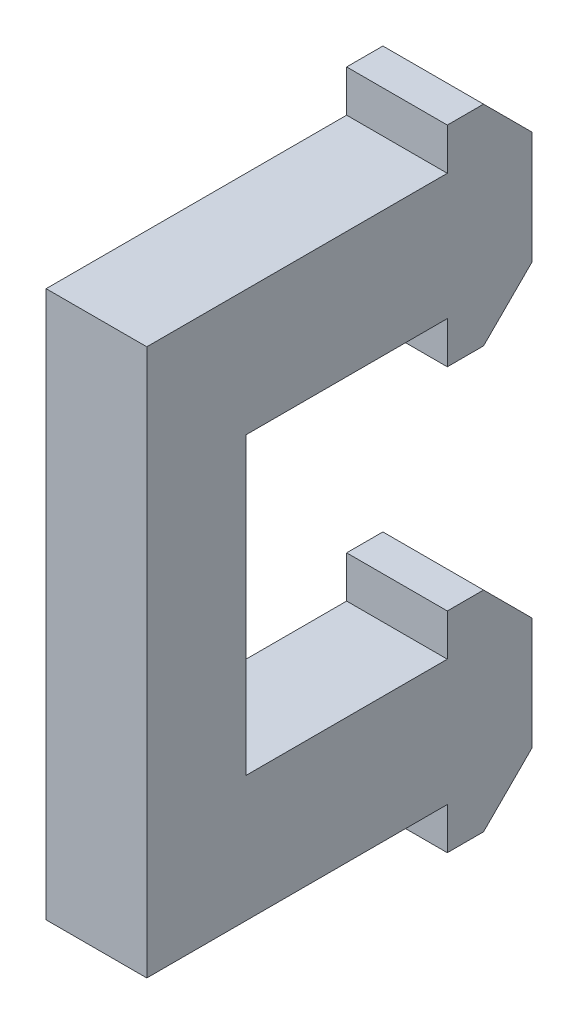
ISO-10303-21;
HEADER;
FILE_DESCRIPTION(('STEP AP214'),'2;1');
FILE_NAME('part.step','',(''),(''),'','','');
FILE_SCHEMA(('AUTOMOTIVE_DESIGN { 1 0 10303 214 1 1 1 1 }'));
ENDSEC;
DATA;
#1=APPLICATION_CONTEXT('core data for automotive mechanical design processes');
#2=APPLICATION_PROTOCOL_DEFINITION('international standard','automotive_design',2000,#1);
#3=PRODUCT_CONTEXT('',#1,'mechanical');
#4=PRODUCT('Part','Part','',(#3));
#5=PRODUCT_RELATED_PRODUCT_CATEGORY('part','',(#4));
#6=PRODUCT_DEFINITION_FORMATION('','',#4);
#7=PRODUCT_DEFINITION_CONTEXT('part definition',#1,'design');
#8=PRODUCT_DEFINITION('design','',#6,#7);
#9=PRODUCT_DEFINITION_SHAPE('','',#8);
#10=(LENGTH_UNIT() NAMED_UNIT(*) SI_UNIT(.MILLI.,.METRE.));
#11=(NAMED_UNIT(*) PLANE_ANGLE_UNIT() SI_UNIT($,.RADIAN.));
#12=(NAMED_UNIT(*) SI_UNIT($,.STERADIAN.) SOLID_ANGLE_UNIT());
#13=UNCERTAINTY_MEASURE_WITH_UNIT(LENGTH_MEASURE(1.E-05),#10,'distance_accuracy_value','');
#14=(GEOMETRIC_REPRESENTATION_CONTEXT(3) GLOBAL_UNCERTAINTY_ASSIGNED_CONTEXT((#13)) GLOBAL_UNIT_ASSIGNED_CONTEXT((#10,
#11,#12)) REPRESENTATION_CONTEXT('',''));
#15=CARTESIAN_POINT('',(0.,0.,0.));
#16=DIRECTION('',(0.,0.,1.));
#17=DIRECTION('',(1.,0.,0.));
#18=AXIS2_PLACEMENT_3D('',#15,#16,#17);
#19=CARTESIAN_POINT('',(5.,3.125,4.2));
#20=DIRECTION('',(0.,0.,-1.));
#21=DIRECTION('',(-1.,0.,0.));
#22=AXIS2_PLACEMENT_3D('',#19,#20,#21);
#23=PLANE('',#22);
#24=DIRECTION('',(0.,-1.,0.));
#25=VECTOR('',#24,1.);
#26=CARTESIAN_POINT('',(0.,3.125,4.2));
#27=LINE('',#26,#25);
#28=CARTESIAN_POINT('',(0.,5.2,4.2));
#29=VERTEX_POINT('',#28);
#30=CARTESIAN_POINT('',(0.,3.125,4.2));
#31=VERTEX_POINT('',#30);
#32=EDGE_CURVE('E148',#29,#31,#27,.T.);
#33=ORIENTED_EDGE('',*,*,#32,.T.);
#34=DIRECTION('',(-1.,0.,0.));
#35=VECTOR('',#34,1.);
#36=CARTESIAN_POINT('',(5.,3.125,4.2));
#37=LINE('',#36,#35);
#38=CARTESIAN_POINT('',(5.,3.125,4.2));
#39=VERTEX_POINT('',#38);
#40=EDGE_CURVE('E11',#39,#31,#37,.T.);
#41=ORIENTED_EDGE('',*,*,#40,.F.);
#42=DIRECTION('',(0.,-1.,0.));
#43=VECTOR('',#42,1.);
#44=CARTESIAN_POINT('',(5.,3.125,4.2));
#45=LINE('',#44,#43);
#46=CARTESIAN_POINT('',(5.,5.2,4.2));
#47=VERTEX_POINT('',#46);
#48=EDGE_CURVE('E167',#47,#39,#45,.T.);
#49=ORIENTED_EDGE('',*,*,#48,.F.);
#50=DIRECTION('',(-1.,0.,0.));
#51=VECTOR('',#50,1.);
#52=CARTESIAN_POINT('',(5.,5.2,4.2));
#53=LINE('',#52,#51);
#54=EDGE_CURVE('E144',#47,#29,#53,.T.);
#55=ORIENTED_EDGE('',*,*,#54,.T.);
#56=EDGE_LOOP('',(#33,#41,#49,#55));
#57=FACE_BOUND('',#56,.T.);
#58=ADVANCED_FACE('F37',(#57),#23,.F.);
#59=CARTESIAN_POINT('',(5.,3.125,4.2));
#60=DIRECTION('',(0.,-1.,0.));
#61=DIRECTION('',(0.,0.,-1.));
#62=AXIS2_PLACEMENT_3D('',#59,#60,#61);
#63=PLANE('',#62);
#64=DIRECTION('',(0.,0.,1.));
#65=VECTOR('',#64,1.);
#66=CARTESIAN_POINT('',(0.,3.125,4.2));
#67=LINE('',#66,#65);
#68=CARTESIAN_POINT('',(0.,3.125,14.2));
#69=VERTEX_POINT('',#68);
#70=EDGE_CURVE('E151',#31,#69,#67,.T.);
#71=ORIENTED_EDGE('',*,*,#70,.T.);
#72=DIRECTION('',(-1.,0.,0.));
#73=VECTOR('',#72,1.);
#74=CARTESIAN_POINT('',(5.,3.125,14.2));
#75=LINE('',#74,#73);
#76=CARTESIAN_POINT('',(5.,3.125,14.2));
#77=VERTEX_POINT('',#76);
#78=EDGE_CURVE('E44',#77,#69,#75,.T.);
#79=ORIENTED_EDGE('',*,*,#78,.F.);
#80=DIRECTION('',(0.,0.,1.));
#81=VECTOR('',#80,1.);
#82=CARTESIAN_POINT('',(5.,3.125,4.2));
#83=LINE('',#82,#81);
#84=EDGE_CURVE('E101',#39,#77,#83,.T.);
#85=ORIENTED_EDGE('',*,*,#84,.F.);
#86=ORIENTED_EDGE('',*,*,#40,.T.);
#87=EDGE_LOOP('',(#71,#79,#85,#86));
#88=FACE_BOUND('',#87,.T.);
#89=ADVANCED_FACE('F188',(#88),#63,.F.);
#90=CARTESIAN_POINT('',(5.,-3.125,14.2));
#91=DIRECTION('',(0.,1.,0.));
#92=DIRECTION('',(0.,0.,1.));
#93=AXIS2_PLACEMENT_3D('',#90,#91,#92);
#94=PLANE('',#93);
#95=DIRECTION('',(0.,0.,-1.));
#96=VECTOR('',#95,1.);
#97=CARTESIAN_POINT('',(0.,-3.125,14.2));
#98=LINE('',#97,#96);
#99=CARTESIAN_POINT('',(0.,-3.125,19.1256451982316));
#100=VERTEX_POINT('',#99);
#101=CARTESIAN_POINT('',(0.,-3.125,4.2));
#102=VERTEX_POINT('',#101);
#103=EDGE_CURVE('E155',#100,#102,#98,.T.);
#104=ORIENTED_EDGE('',*,*,#103,.T.);
#105=DIRECTION('',(-1.,0.,0.));
#106=VECTOR('',#105,1.);
#107=CARTESIAN_POINT('',(5.,-3.125,4.2));
#108=LINE('',#107,#106);
#109=CARTESIAN_POINT('',(5.,-3.125,4.2));
#110=VERTEX_POINT('',#109);
#111=EDGE_CURVE('E177',#110,#102,#108,.T.);
#112=ORIENTED_EDGE('',*,*,#111,.F.);
#113=DIRECTION('',(0.,0.,-1.));
#114=VECTOR('',#113,1.);
#115=CARTESIAN_POINT('',(5.,-3.125,14.2));
#116=LINE('',#115,#114);
#117=CARTESIAN_POINT('',(5.,-3.125,19.1256451982316));
#118=VERTEX_POINT('',#117);
#119=EDGE_CURVE('E209',#118,#110,#116,.T.);
#120=ORIENTED_EDGE('',*,*,#119,.F.);
#121=DIRECTION('',(-1.,0.,0.));
#122=VECTOR('',#121,1.);
#123=CARTESIAN_POINT('',(39.1568924685001,-3.125,19.1256451982316));
#124=LINE('',#123,#122);
#125=EDGE_CURVE('E196',#118,#100,#124,.T.);
#126=ORIENTED_EDGE('',*,*,#125,.T.);
#127=EDGE_LOOP('',(#104,#112,#120,#126));
#128=FACE_BOUND('',#127,.T.);
#129=ADVANCED_FACE('F329',(#128),#94,.F.);
#130=CARTESIAN_POINT('',(5.,-3.125,4.2));
#131=DIRECTION('',(0.,0.,-1.));
#132=DIRECTION('',(-1.,0.,0.));
#133=AXIS2_PLACEMENT_3D('',#130,#131,#132);
#134=PLANE('',#133);
#135=DIRECTION('',(0.,-1.,0.));
#136=VECTOR('',#135,1.);
#137=CARTESIAN_POINT('',(0.,-3.125,4.2));
#138=LINE('',#137,#136);
#139=CARTESIAN_POINT('',(0.,-5.2,4.2));
#140=VERTEX_POINT('',#139);
#141=EDGE_CURVE('E157',#102,#140,#138,.T.);
#142=ORIENTED_EDGE('',*,*,#141,.T.);
#143=DIRECTION('',(-1.,0.,0.));
#144=VECTOR('',#143,1.);
#145=CARTESIAN_POINT('',(5.,-5.2,4.2));
#146=LINE('',#145,#144);
#147=CARTESIAN_POINT('',(5.,-5.2,4.2));
#148=VERTEX_POINT('',#147);
#149=EDGE_CURVE('E174',#148,#140,#146,.T.);
#150=ORIENTED_EDGE('',*,*,#149,.F.);
#151=DIRECTION('',(0.,-1.,0.));
#152=VECTOR('',#151,1.);
#153=CARTESIAN_POINT('',(5.,-3.125,4.2));
#154=LINE('',#153,#152);
#155=EDGE_CURVE('E211',#110,#148,#154,.T.);
#156=ORIENTED_EDGE('',*,*,#155,.F.);
#157=ORIENTED_EDGE('',*,*,#111,.T.);
#158=EDGE_LOOP('',(#142,#150,#156,#157));
#159=FACE_BOUND('',#158,.T.);
#160=ADVANCED_FACE('F411',(#159),#134,.F.);
#161=CARTESIAN_POINT('',(5.,-5.2,4.2));
#162=DIRECTION('',(0.,1.,0.));
#163=DIRECTION('',(0.,0.,1.));
#164=AXIS2_PLACEMENT_3D('',#161,#162,#163);
#165=PLANE('',#164);
#166=DIRECTION('',(0.,0.,-1.));
#167=VECTOR('',#166,1.);
#168=CARTESIAN_POINT('',(0.,-5.2,4.2));
#169=LINE('',#168,#167);
#170=CARTESIAN_POINT('',(0.,-5.2,2.4));
#171=VERTEX_POINT('',#170);
#172=EDGE_CURVE('E159',#140,#171,#169,.T.);
#173=ORIENTED_EDGE('',*,*,#172,.T.);
#174=DIRECTION('',(-1.,0.,0.));
#175=VECTOR('',#174,1.);
#176=CARTESIAN_POINT('',(5.,-5.2,2.4));
#177=LINE('',#176,#175);
#178=CARTESIAN_POINT('',(5.,-5.2,2.4));
#179=VERTEX_POINT('',#178);
#180=EDGE_CURVE('E171',#179,#171,#177,.T.);
#181=ORIENTED_EDGE('',*,*,#180,.F.);
#182=DIRECTION('',(0.,0.,-1.));
#183=VECTOR('',#182,1.);
#184=CARTESIAN_POINT('',(5.,-5.2,4.2));
#185=LINE('',#184,#183);
#186=EDGE_CURVE('E213',#148,#179,#185,.T.);
#187=ORIENTED_EDGE('',*,*,#186,.F.);
#188=ORIENTED_EDGE('',*,*,#149,.T.);
#189=EDGE_LOOP('',(#173,#181,#187,#188));
#190=FACE_BOUND('',#189,.T.);
#191=ADVANCED_FACE('F219',(#190),#165,.F.);
#192=CARTESIAN_POINT('',(5.,-5.2,2.4));
#193=DIRECTION('',(0.,0.707106781186548,0.707106781186548));
#194=DIRECTION('',(0.,-0.707106781186548,0.707106781186548));
#195=AXIS2_PLACEMENT_3D('',#192,#193,#194);
#196=PLANE('',#195);
#197=DIRECTION('',(0.,0.707106781186547,-0.707106781186547));
#198=VECTOR('',#197,1.);
#199=CARTESIAN_POINT('',(0.,-5.2,2.4));
#200=LINE('',#199,#198);
#201=CARTESIAN_POINT('',(0.,-2.8,0.));
#202=VERTEX_POINT('',#201);
#203=EDGE_CURVE('E161',#171,#202,#200,.T.);
#204=ORIENTED_EDGE('',*,*,#203,.T.);
#205=DIRECTION('',(-1.,0.,0.));
#206=VECTOR('',#205,1.);
#207=CARTESIAN_POINT('',(5.,-2.8,0.));
#208=LINE('',#207,#206);
#209=CARTESIAN_POINT('',(5.,-2.8,0.));
#210=VERTEX_POINT('',#209);
#211=EDGE_CURVE('E139',#210,#202,#208,.T.);
#212=ORIENTED_EDGE('',*,*,#211,.F.);
#213=DIRECTION('',(0.,0.707106781186547,-0.707106781186547));
#214=VECTOR('',#213,1.);
#215=CARTESIAN_POINT('',(5.,-5.2,2.4));
#216=LINE('',#215,#214);
#217=EDGE_CURVE('E127',#179,#210,#216,.T.);
#218=ORIENTED_EDGE('',*,*,#217,.F.);
#219=ORIENTED_EDGE('',*,*,#180,.T.);
#220=EDGE_LOOP('',(#204,#212,#218,#219));
#221=FACE_BOUND('',#220,.T.);
#222=ADVANCED_FACE('F223',(#221),#196,.F.);
#223=CARTESIAN_POINT('',(5.,2.8,0.));
#224=DIRECTION('',(0.,0.,1.));
#225=DIRECTION('',(0.,-1.,0.));
#226=AXIS2_PLACEMENT_3D('',#223,#224,#225);
#227=PLANE('',#226);
#228=DIRECTION('',(0.,1.,0.));
#229=VECTOR('',#228,1.);
#230=CARTESIAN_POINT('',(0.,2.8,0.));
#231=LINE('',#230,#229);
#232=CARTESIAN_POINT('',(0.,2.8,0.));
#233=VERTEX_POINT('',#232);
#234=EDGE_CURVE('E136',#202,#233,#231,.T.);
#235=ORIENTED_EDGE('',*,*,#234,.T.);
#236=DIRECTION('',(-1.,0.,0.));
#237=VECTOR('',#236,1.);
#238=CARTESIAN_POINT('',(5.,2.8,0.));
#239=LINE('',#238,#237);
#240=CARTESIAN_POINT('',(5.,2.8,0.));
#241=VERTEX_POINT('',#240);
#242=EDGE_CURVE('E133',#241,#233,#239,.T.);
#243=ORIENTED_EDGE('',*,*,#242,.F.);
#244=DIRECTION('',(0.,1.,0.));
#245=VECTOR('',#244,1.);
#246=CARTESIAN_POINT('',(5.,2.8,0.));
#247=LINE('',#246,#245);
#248=EDGE_CURVE('E119',#210,#241,#247,.T.);
#249=ORIENTED_EDGE('',*,*,#248,.F.);
#250=ORIENTED_EDGE('',*,*,#211,.T.);
#251=EDGE_LOOP('',(#235,#243,#249,#250));
#252=FACE_BOUND('',#251,.T.);
#253=ADVANCED_FACE('F134',(#252),#227,.F.);
#254=CARTESIAN_POINT('',(5.,5.2,2.4));
#255=DIRECTION('',(0.,-0.707106781186548,0.707106781186547));
#256=DIRECTION('',(0.,-0.707106781186547,-0.707106781186548));
#257=AXIS2_PLACEMENT_3D('',#254,#255,#256);
#258=PLANE('',#257);
#259=DIRECTION('',(0.,0.707106781186547,0.707106781186548));
#260=VECTOR('',#259,1.);
#261=CARTESIAN_POINT('',(0.,5.2,2.4));
#262=LINE('',#261,#260);
#263=CARTESIAN_POINT('',(0.,5.2,2.4));
#264=VERTEX_POINT('',#263);
#265=EDGE_CURVE('E164',#233,#264,#262,.T.);
#266=ORIENTED_EDGE('',*,*,#265,.T.);
#267=DIRECTION('',(-1.,0.,0.));
#268=VECTOR('',#267,1.);
#269=CARTESIAN_POINT('',(5.,5.2,2.4));
#270=LINE('',#269,#268);
#271=CARTESIAN_POINT('',(5.,5.2,2.4));
#272=VERTEX_POINT('',#271);
#273=EDGE_CURVE('E140',#272,#264,#270,.T.);
#274=ORIENTED_EDGE('',*,*,#273,.F.);
#275=DIRECTION('',(0.,0.707106781186547,0.707106781186548));
#276=VECTOR('',#275,1.);
#277=CARTESIAN_POINT('',(5.,5.2,2.4));
#278=LINE('',#277,#276);
#279=EDGE_CURVE('E124',#241,#272,#278,.T.);
#280=ORIENTED_EDGE('',*,*,#279,.F.);
#281=ORIENTED_EDGE('',*,*,#242,.T.);
#282=EDGE_LOOP('',(#266,#274,#280,#281));
#283=FACE_BOUND('',#282,.T.);
#284=ADVANCED_FACE('F142',(#283),#258,.F.);
#285=CARTESIAN_POINT('',(5.,5.2,4.2));
#286=DIRECTION('',(0.,-1.,0.));
#287=DIRECTION('',(0.,0.,-1.));
#288=AXIS2_PLACEMENT_3D('',#285,#286,#287);
#289=PLANE('',#288);
#290=DIRECTION('',(0.,0.,1.));
#291=VECTOR('',#290,1.);
#292=CARTESIAN_POINT('',(0.,5.2,4.2));
#293=LINE('',#292,#291);
#294=EDGE_CURVE('E93',#264,#29,#293,.T.);
#295=ORIENTED_EDGE('',*,*,#294,.T.);
#296=ORIENTED_EDGE('',*,*,#54,.F.);
#297=DIRECTION('',(0.,0.,1.));
#298=VECTOR('',#297,1.);
#299=CARTESIAN_POINT('',(5.,5.2,4.2));
#300=LINE('',#299,#298);
#301=EDGE_CURVE('E60',#272,#47,#300,.T.);
#302=ORIENTED_EDGE('',*,*,#301,.F.);
#303=ORIENTED_EDGE('',*,*,#273,.T.);
#304=EDGE_LOOP('',(#295,#296,#302,#303));
#305=FACE_BOUND('',#304,.T.);
#306=ADVANCED_FACE('F224',(#305),#289,.F.);
#307=CARTESIAN_POINT('',(5.,0.,0.));
#308=DIRECTION('',(-1.,0.,0.));
#309=DIRECTION('',(0.,0.,1.));
#310=AXIS2_PLACEMENT_3D('',#307,#308,#309);
#311=PLANE('',#310);
#312=DIRECTION('',(0.,0.,-1.));
#313=VECTOR('',#312,1.);
#314=CARTESIAN_POINT('',(5.,24.025,14.2));
#315=LINE('',#314,#313);
#316=CARTESIAN_POINT('',(5.,24.025,19.1256451982316));
#317=VERTEX_POINT('',#316);
#318=CARTESIAN_POINT('',(5.,24.025,4.19999999999999));
#319=VERTEX_POINT('',#318);
#320=EDGE_CURVE('E288',#317,#319,#315,.T.);
#321=ORIENTED_EDGE('',*,*,#320,.F.);
#322=DIRECTION('',(0.,-1.,0.));
#323=VECTOR('',#322,1.);
#324=CARTESIAN_POINT('',(5.,-3.125,19.1256451982316));
#325=LINE('',#324,#323);
#326=EDGE_CURVE('E206',#317,#118,#325,.T.);
#327=ORIENTED_EDGE('',*,*,#326,.T.);
#328=ORIENTED_EDGE('',*,*,#119,.T.);
#329=ORIENTED_EDGE('',*,*,#155,.T.);
#330=ORIENTED_EDGE('',*,*,#186,.T.);
#331=ORIENTED_EDGE('',*,*,#217,.T.);
#332=ORIENTED_EDGE('',*,*,#248,.T.);
#333=ORIENTED_EDGE('',*,*,#279,.T.);
#334=ORIENTED_EDGE('',*,*,#301,.T.);
#335=ORIENTED_EDGE('',*,*,#48,.T.);
#336=ORIENTED_EDGE('',*,*,#84,.T.);
#337=DIRECTION('',(0.,1.,0.));
#338=VECTOR('',#337,1.);
#339=CARTESIAN_POINT('',(5.,-3.125,14.2));
#340=LINE('',#339,#338);
#341=CARTESIAN_POINT('',(5.,17.775,14.2));
#342=VERTEX_POINT('',#341);
#343=EDGE_CURVE('E152',#77,#342,#340,.T.);
#344=ORIENTED_EDGE('',*,*,#343,.T.);
#345=DIRECTION('',(0.,0.,1.));
#346=VECTOR('',#345,1.);
#347=CARTESIAN_POINT('',(5.,17.775,4.19999999999999));
#348=LINE('',#347,#346);
#349=CARTESIAN_POINT('',(5.,17.775,4.19999999999999));
#350=VERTEX_POINT('',#349);
#351=EDGE_CURVE('E232',#350,#342,#348,.T.);
#352=ORIENTED_EDGE('',*,*,#351,.F.);
#353=DIRECTION('',(0.,1.,0.));
#354=VECTOR('',#353,1.);
#355=CARTESIAN_POINT('',(5.,17.775,4.19999999999999));
#356=LINE('',#355,#354);
#357=CARTESIAN_POINT('',(5.,15.7,4.2));
#358=VERTEX_POINT('',#357);
#359=EDGE_CURVE('E262',#358,#350,#356,.T.);
#360=ORIENTED_EDGE('',*,*,#359,.F.);
#361=DIRECTION('',(0.,0.,1.));
#362=VECTOR('',#361,1.);
#363=CARTESIAN_POINT('',(5.,15.7,4.2));
#364=LINE('',#363,#362);
#365=CARTESIAN_POINT('',(5.,15.7,2.4));
#366=VERTEX_POINT('',#365);
#367=EDGE_CURVE('E306',#366,#358,#364,.T.);
#368=ORIENTED_EDGE('',*,*,#367,.F.);
#369=DIRECTION('',(0.,-0.707106781186547,0.707106781186548));
#370=VECTOR('',#369,1.);
#371=CARTESIAN_POINT('',(5.,15.7,2.4));
#372=LINE('',#371,#370);
#373=CARTESIAN_POINT('',(5.,18.1,0.));
#374=VERTEX_POINT('',#373);
#375=EDGE_CURVE('E303',#374,#366,#372,.T.);
#376=ORIENTED_EDGE('',*,*,#375,.F.);
#377=DIRECTION('',(0.,-1.,0.));
#378=VECTOR('',#377,1.);
#379=CARTESIAN_POINT('',(5.,18.1,0.));
#380=LINE('',#379,#378);
#381=CARTESIAN_POINT('',(5.,23.7,0.));
#382=VERTEX_POINT('',#381);
#383=EDGE_CURVE('E300',#382,#374,#380,.T.);
#384=ORIENTED_EDGE('',*,*,#383,.F.);
#385=DIRECTION('',(0.,-0.707106781186548,-0.707106781186547));
#386=VECTOR('',#385,1.);
#387=CARTESIAN_POINT('',(5.,26.1,2.39999999999998));
#388=LINE('',#387,#386);
#389=CARTESIAN_POINT('',(5.,26.1,2.39999999999998));
#390=VERTEX_POINT('',#389);
#391=EDGE_CURVE('E297',#390,#382,#388,.T.);
#392=ORIENTED_EDGE('',*,*,#391,.F.);
#393=DIRECTION('',(0.,0.,-1.));
#394=VECTOR('',#393,1.);
#395=CARTESIAN_POINT('',(5.,26.1,4.19999999999998));
#396=LINE('',#395,#394);
#397=CARTESIAN_POINT('',(5.,26.1,4.19999999999998));
#398=VERTEX_POINT('',#397);
#399=EDGE_CURVE('E294',#398,#390,#396,.T.);
#400=ORIENTED_EDGE('',*,*,#399,.F.);
#401=DIRECTION('',(0.,1.,0.));
#402=VECTOR('',#401,1.);
#403=CARTESIAN_POINT('',(5.,24.025,4.19999999999999));
#404=LINE('',#403,#402);
#405=EDGE_CURVE('E291',#319,#398,#404,.T.);
#406=ORIENTED_EDGE('',*,*,#405,.F.);
#407=EDGE_LOOP('',(#321,#327,#328,#329,#330,#331,#332,#333,#334,#335,#336,#344,#352,#360,#368,
#376,#384,#392,#400,#406));
#408=FACE_BOUND('',#407,.T.);
#409=ADVANCED_FACE('F122',(#408),#311,.F.);
#410=CARTESIAN_POINT('',(0.,0.,0.));
#411=DIRECTION('',(-1.,0.,0.));
#412=DIRECTION('',(0.,0.,1.));
#413=AXIS2_PLACEMENT_3D('',#410,#411,#412);
#414=PLANE('',#413);
#415=DIRECTION('',(0.,1.,0.));
#416=VECTOR('',#415,1.);
#417=CARTESIAN_POINT('',(0.,-3.125,19.1256451982316));
#418=LINE('',#417,#416);
#419=CARTESIAN_POINT('',(0.,24.025,19.1256451982316));
#420=VERTEX_POINT('',#419);
#421=EDGE_CURVE('E193',#100,#420,#418,.T.);
#422=ORIENTED_EDGE('',*,*,#421,.T.);
#423=DIRECTION('',(0.,0.,-1.));
#424=VECTOR('',#423,1.);
#425=CARTESIAN_POINT('',(0.,24.025,14.2));
#426=LINE('',#425,#424);
#427=CARTESIAN_POINT('',(0.,24.025,4.19999999999999));
#428=VERTEX_POINT('',#427);
#429=EDGE_CURVE('E263',#420,#428,#426,.T.);
#430=ORIENTED_EDGE('',*,*,#429,.T.);
#431=DIRECTION('',(0.,1.,0.));
#432=VECTOR('',#431,1.);
#433=CARTESIAN_POINT('',(0.,24.025,4.19999999999999));
#434=LINE('',#433,#432);
#435=CARTESIAN_POINT('',(0.,26.1,4.19999999999998));
#436=VERTEX_POINT('',#435);
#437=EDGE_CURVE('E266',#428,#436,#434,.T.);
#438=ORIENTED_EDGE('',*,*,#437,.T.);
#439=DIRECTION('',(0.,0.,-1.));
#440=VECTOR('',#439,1.);
#441=CARTESIAN_POINT('',(0.,26.1,4.19999999999998));
#442=LINE('',#441,#440);
#443=CARTESIAN_POINT('',(0.,26.1,2.39999999999998));
#444=VERTEX_POINT('',#443);
#445=EDGE_CURVE('E269',#436,#444,#442,.T.);
#446=ORIENTED_EDGE('',*,*,#445,.T.);
#447=DIRECTION('',(0.,-0.707106781186548,-0.707106781186547));
#448=VECTOR('',#447,1.);
#449=CARTESIAN_POINT('',(0.,26.1,2.39999999999998));
#450=LINE('',#449,#448);
#451=CARTESIAN_POINT('',(0.,23.7,0.));
#452=VERTEX_POINT('',#451);
#453=EDGE_CURVE('E272',#444,#452,#450,.T.);
#454=ORIENTED_EDGE('',*,*,#453,.T.);
#455=DIRECTION('',(0.,-1.,0.));
#456=VECTOR('',#455,1.);
#457=CARTESIAN_POINT('',(0.,18.1,0.));
#458=LINE('',#457,#456);
#459=CARTESIAN_POINT('',(0.,18.1,0.));
#460=VERTEX_POINT('',#459);
#461=EDGE_CURVE('E275',#452,#460,#458,.T.);
#462=ORIENTED_EDGE('',*,*,#461,.T.);
#463=DIRECTION('',(0.,-0.707106781186547,0.707106781186548));
#464=VECTOR('',#463,1.);
#465=CARTESIAN_POINT('',(0.,15.7,2.4));
#466=LINE('',#465,#464);
#467=CARTESIAN_POINT('',(0.,15.7,2.4));
#468=VERTEX_POINT('',#467);
#469=EDGE_CURVE('E278',#460,#468,#466,.T.);
#470=ORIENTED_EDGE('',*,*,#469,.T.);
#471=DIRECTION('',(0.,0.,1.));
#472=VECTOR('',#471,1.);
#473=CARTESIAN_POINT('',(0.,15.7,4.2));
#474=LINE('',#473,#472);
#475=CARTESIAN_POINT('',(0.,15.7,4.2));
#476=VERTEX_POINT('',#475);
#477=EDGE_CURVE('E281',#468,#476,#474,.T.);
#478=ORIENTED_EDGE('',*,*,#477,.T.);
#479=DIRECTION('',(0.,1.,0.));
#480=VECTOR('',#479,1.);
#481=CARTESIAN_POINT('',(0.,17.775,4.19999999999999));
#482=LINE('',#481,#480);
#483=CARTESIAN_POINT('',(0.,17.775,4.19999999999999));
#484=VERTEX_POINT('',#483);
#485=EDGE_CURVE('E284',#476,#484,#482,.T.);
#486=ORIENTED_EDGE('',*,*,#485,.T.);
#487=DIRECTION('',(0.,0.,1.));
#488=VECTOR('',#487,1.);
#489=CARTESIAN_POINT('',(0.,17.775,4.19999999999999));
#490=LINE('',#489,#488);
#491=CARTESIAN_POINT('',(0.,17.775,14.2));
#492=VERTEX_POINT('',#491);
#493=EDGE_CURVE('E51',#484,#492,#490,.T.);
#494=ORIENTED_EDGE('',*,*,#493,.T.);
#495=DIRECTION('',(0.,-1.,0.));
#496=VECTOR('',#495,1.);
#497=CARTESIAN_POINT('',(0.,-3.125,14.2));
#498=LINE('',#497,#496);
#499=EDGE_CURVE('E185',#492,#69,#498,.T.);
#500=ORIENTED_EDGE('',*,*,#499,.T.);
#501=ORIENTED_EDGE('',*,*,#70,.F.);
#502=ORIENTED_EDGE('',*,*,#32,.F.);
#503=ORIENTED_EDGE('',*,*,#294,.F.);
#504=ORIENTED_EDGE('',*,*,#265,.F.);
#505=ORIENTED_EDGE('',*,*,#234,.F.);
#506=ORIENTED_EDGE('',*,*,#203,.F.);
#507=ORIENTED_EDGE('',*,*,#172,.F.);
#508=ORIENTED_EDGE('',*,*,#141,.F.);
#509=ORIENTED_EDGE('',*,*,#103,.F.);
#510=EDGE_LOOP('',(#422,#430,#438,#446,#454,#462,#470,#478,#486,#494,#500,#501,#502,#503,#504,
#505,#506,#507,#508,#509));
#511=FACE_BOUND('',#510,.T.);
#512=ADVANCED_FACE('F192',(#511),#414,.T.);
#513=CARTESIAN_POINT('',(39.1568924685001,-3.125,14.2));
#514=DIRECTION('',(0.,0.,-1.));
#515=DIRECTION('',(-1.,0.,0.));
#516=AXIS2_PLACEMENT_3D('',#513,#514,#515);
#517=PLANE('',#516);
#518=DIRECTION('',(-1.,0.,0.));
#519=VECTOR('',#518,1.);
#520=CARTESIAN_POINT('',(5.,17.775,14.2));
#521=LINE('',#520,#519);
#522=EDGE_CURVE('E256',#342,#492,#521,.T.);
#523=ORIENTED_EDGE('',*,*,#522,.F.);
#524=ORIENTED_EDGE('',*,*,#343,.F.);
#525=ORIENTED_EDGE('',*,*,#78,.T.);
#526=ORIENTED_EDGE('',*,*,#499,.F.);
#527=EDGE_LOOP('',(#523,#524,#525,#526));
#528=FACE_BOUND('',#527,.T.);
#529=ADVANCED_FACE('F184',(#528),#517,.T.);
#530=CARTESIAN_POINT('',(39.1568924685001,-3.125,19.1256451982316));
#531=DIRECTION('',(0.,0.,1.));
#532=DIRECTION('',(1.,0.,0.));
#533=AXIS2_PLACEMENT_3D('',#530,#531,#532);
#534=PLANE('',#533);
#535=DIRECTION('',(-1.,0.,0.));
#536=VECTOR('',#535,1.);
#537=CARTESIAN_POINT('',(5.,24.025,19.1256451982316));
#538=LINE('',#537,#536);
#539=EDGE_CURVE('E286',#317,#420,#538,.T.);
#540=ORIENTED_EDGE('',*,*,#539,.T.);
#541=ORIENTED_EDGE('',*,*,#421,.F.);
#542=ORIENTED_EDGE('',*,*,#125,.F.);
#543=ORIENTED_EDGE('',*,*,#326,.F.);
#544=EDGE_LOOP('',(#540,#541,#542,#543));
#545=FACE_BOUND('',#544,.T.);
#546=ADVANCED_FACE('F316',(#545),#534,.T.);
#547=CARTESIAN_POINT('',(5.,17.775,4.19999999999999));
#548=DIRECTION('',(0.,0.,1.));
#549=DIRECTION('',(0.,-1.,0.));
#550=AXIS2_PLACEMENT_3D('',#547,#548,#549);
#551=PLANE('',#550);
#552=ORIENTED_EDGE('',*,*,#485,.F.);
#553=DIRECTION('',(-1.,0.,0.));
#554=VECTOR('',#553,1.);
#555=CARTESIAN_POINT('',(5.,15.7,4.2));
#556=LINE('',#555,#554);
#557=EDGE_CURVE('E194',#358,#476,#556,.T.);
#558=ORIENTED_EDGE('',*,*,#557,.F.);
#559=ORIENTED_EDGE('',*,*,#359,.T.);
#560=DIRECTION('',(-1.,0.,0.));
#561=VECTOR('',#560,1.);
#562=CARTESIAN_POINT('',(5.,17.775,4.19999999999999));
#563=LINE('',#562,#561);
#564=EDGE_CURVE('E258',#350,#484,#563,.T.);
#565=ORIENTED_EDGE('',*,*,#564,.T.);
#566=EDGE_LOOP('',(#552,#558,#559,#565));
#567=FACE_BOUND('',#566,.T.);
#568=ADVANCED_FACE('F395',(#567),#551,.T.);
#569=CARTESIAN_POINT('',(5.,15.7,4.2));
#570=DIRECTION('',(0.,-1.,0.));
#571=DIRECTION('',(0.,0.,-1.));
#572=AXIS2_PLACEMENT_3D('',#569,#570,#571);
#573=PLANE('',#572);
#574=ORIENTED_EDGE('',*,*,#477,.F.);
#575=DIRECTION('',(-1.,0.,0.));
#576=VECTOR('',#575,1.);
#577=CARTESIAN_POINT('',(5.,15.7,2.4));
#578=LINE('',#577,#576);
#579=EDGE_CURVE('E199',#366,#468,#578,.T.);
#580=ORIENTED_EDGE('',*,*,#579,.F.);
#581=ORIENTED_EDGE('',*,*,#367,.T.);
#582=ORIENTED_EDGE('',*,*,#557,.T.);
#583=EDGE_LOOP('',(#574,#580,#581,#582));
#584=FACE_BOUND('',#583,.T.);
#585=ADVANCED_FACE('F392',(#584),#573,.T.);
#586=CARTESIAN_POINT('',(5.,15.7,2.4));
#587=DIRECTION('',(0.,-0.707106781186548,-0.707106781186547));
#588=DIRECTION('',(0.,0.707106781186547,-0.707106781186548));
#589=AXIS2_PLACEMENT_3D('',#586,#587,#588);
#590=PLANE('',#589);
#591=ORIENTED_EDGE('',*,*,#469,.F.);
#592=DIRECTION('',(-1.,0.,0.));
#593=VECTOR('',#592,1.);
#594=CARTESIAN_POINT('',(5.,18.1,0.));
#595=LINE('',#594,#593);
#596=EDGE_CURVE('E241',#374,#460,#595,.T.);
#597=ORIENTED_EDGE('',*,*,#596,.F.);
#598=ORIENTED_EDGE('',*,*,#375,.T.);
#599=ORIENTED_EDGE('',*,*,#579,.T.);
#600=EDGE_LOOP('',(#591,#597,#598,#599));
#601=FACE_BOUND('',#600,.T.);
#602=ADVANCED_FACE('F388',(#601),#590,.T.);
#603=CARTESIAN_POINT('',(5.,18.1,0.));
#604=DIRECTION('',(0.,0.,-1.));
#605=DIRECTION('',(0.,1.,0.));
#606=AXIS2_PLACEMENT_3D('',#603,#604,#605);
#607=PLANE('',#606);
#608=ORIENTED_EDGE('',*,*,#461,.F.);
#609=DIRECTION('',(-1.,0.,0.));
#610=VECTOR('',#609,1.);
#611=CARTESIAN_POINT('',(5.,23.7,0.));
#612=LINE('',#611,#610);
#613=EDGE_CURVE('E244',#382,#452,#612,.T.);
#614=ORIENTED_EDGE('',*,*,#613,.F.);
#615=ORIENTED_EDGE('',*,*,#383,.T.);
#616=ORIENTED_EDGE('',*,*,#596,.T.);
#617=EDGE_LOOP('',(#608,#614,#615,#616));
#618=FACE_BOUND('',#617,.T.);
#619=ADVANCED_FACE('F384',(#618),#607,.T.);
#620=CARTESIAN_POINT('',(5.,26.1,2.39999999999998));
#621=DIRECTION('',(0.,0.707106781186547,-0.707106781186548));
#622=DIRECTION('',(0.,0.707106781186548,0.707106781186547));
#623=AXIS2_PLACEMENT_3D('',#620,#621,#622);
#624=PLANE('',#623);
#625=ORIENTED_EDGE('',*,*,#453,.F.);
#626=DIRECTION('',(-1.,0.,0.));
#627=VECTOR('',#626,1.);
#628=CARTESIAN_POINT('',(5.,26.1,2.39999999999998));
#629=LINE('',#628,#627);
#630=EDGE_CURVE('E247',#390,#444,#629,.T.);
#631=ORIENTED_EDGE('',*,*,#630,.F.);
#632=ORIENTED_EDGE('',*,*,#391,.T.);
#633=ORIENTED_EDGE('',*,*,#613,.T.);
#634=EDGE_LOOP('',(#625,#631,#632,#633));
#635=FACE_BOUND('',#634,.T.);
#636=ADVANCED_FACE('F380',(#635),#624,.T.);
#637=CARTESIAN_POINT('',(5.,26.1,4.19999999999998));
#638=DIRECTION('',(0.,1.,0.));
#639=DIRECTION('',(0.,0.,1.));
#640=AXIS2_PLACEMENT_3D('',#637,#638,#639);
#641=PLANE('',#640);
#642=ORIENTED_EDGE('',*,*,#445,.F.);
#643=DIRECTION('',(-1.,0.,0.));
#644=VECTOR('',#643,1.);
#645=CARTESIAN_POINT('',(5.,26.1,4.19999999999998));
#646=LINE('',#645,#644);
#647=EDGE_CURVE('E250',#398,#436,#646,.T.);
#648=ORIENTED_EDGE('',*,*,#647,.F.);
#649=ORIENTED_EDGE('',*,*,#399,.T.);
#650=ORIENTED_EDGE('',*,*,#630,.T.);
#651=EDGE_LOOP('',(#642,#648,#649,#650));
#652=FACE_BOUND('',#651,.T.);
#653=ADVANCED_FACE('F377',(#652),#641,.T.);
#654=CARTESIAN_POINT('',(5.,24.025,4.19999999999999));
#655=DIRECTION('',(0.,0.,1.));
#656=DIRECTION('',(0.,-1.,0.));
#657=AXIS2_PLACEMENT_3D('',#654,#655,#656);
#658=PLANE('',#657);
#659=ORIENTED_EDGE('',*,*,#437,.F.);
#660=DIRECTION('',(-1.,0.,0.));
#661=VECTOR('',#660,1.);
#662=CARTESIAN_POINT('',(5.,24.025,4.19999999999999));
#663=LINE('',#662,#661);
#664=EDGE_CURVE('E253',#319,#428,#663,.T.);
#665=ORIENTED_EDGE('',*,*,#664,.F.);
#666=ORIENTED_EDGE('',*,*,#405,.T.);
#667=ORIENTED_EDGE('',*,*,#647,.T.);
#668=EDGE_LOOP('',(#659,#665,#666,#667));
#669=FACE_BOUND('',#668,.T.);
#670=ADVANCED_FACE('F373',(#669),#658,.T.);
#671=CARTESIAN_POINT('',(5.,24.025,14.2));
#672=DIRECTION('',(0.,1.,0.));
#673=DIRECTION('',(0.,0.,1.));
#674=AXIS2_PLACEMENT_3D('',#671,#672,#673);
#675=PLANE('',#674);
#676=ORIENTED_EDGE('',*,*,#429,.F.);
#677=ORIENTED_EDGE('',*,*,#539,.F.);
#678=ORIENTED_EDGE('',*,*,#320,.T.);
#679=ORIENTED_EDGE('',*,*,#664,.T.);
#680=EDGE_LOOP('',(#676,#677,#678,#679));
#681=FACE_BOUND('',#680,.T.);
#682=ADVANCED_FACE('F370',(#681),#675,.T.);
#683=CARTESIAN_POINT('',(5.,17.775,4.19999999999999));
#684=DIRECTION('',(0.,-1.,0.));
#685=DIRECTION('',(0.,0.,-1.));
#686=AXIS2_PLACEMENT_3D('',#683,#684,#685);
#687=PLANE('',#686);
#688=ORIENTED_EDGE('',*,*,#493,.F.);
#689=ORIENTED_EDGE('',*,*,#564,.F.);
#690=ORIENTED_EDGE('',*,*,#351,.T.);
#691=ORIENTED_EDGE('',*,*,#522,.T.);
#692=EDGE_LOOP('',(#688,#689,#690,#691));
#693=FACE_BOUND('',#692,.T.);
#694=ADVANCED_FACE('F397',(#693),#687,.T.);
#695=CLOSED_SHELL('',(#58,#89,#129,#160,#191,#222,#253,#284,#306,#409,#512,#529,#546,#568,#585,
#602,#619,#636,#653,#670,#682,#694));
#696=MANIFOLD_SOLID_BREP('B2',#695);
#697=ADVANCED_BREP_SHAPE_REPRESENTATION('',(#18,#696),#14);
#698=SHAPE_DEFINITION_REPRESENTATION(#9,#697);
ENDSEC;
END-ISO-10303-21;
